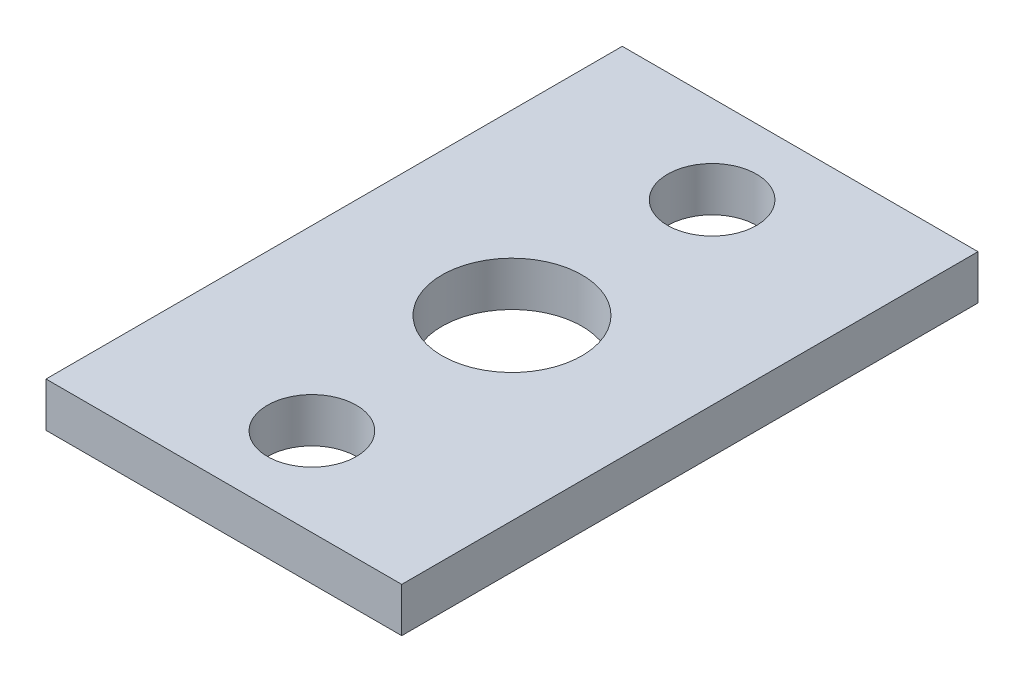
ISO-10303-21;
HEADER;
FILE_DESCRIPTION(('STEP AP214'),'2;1');
FILE_NAME('part.step','',(''),(''),'','','');
FILE_SCHEMA(('AUTOMOTIVE_DESIGN { 1 0 10303 214 1 1 1 1 }'));
ENDSEC;
DATA;
#1=APPLICATION_CONTEXT('core data for automotive mechanical design processes');
#2=APPLICATION_PROTOCOL_DEFINITION('international standard','automotive_design',2000,#1);
#3=PRODUCT_CONTEXT('',#1,'mechanical');
#4=PRODUCT('Part','Part','',(#3));
#5=PRODUCT_RELATED_PRODUCT_CATEGORY('part','',(#4));
#6=PRODUCT_DEFINITION_FORMATION('','',#4);
#7=PRODUCT_DEFINITION_CONTEXT('part definition',#1,'design');
#8=PRODUCT_DEFINITION('design','',#6,#7);
#9=PRODUCT_DEFINITION_SHAPE('','',#8);
#10=(LENGTH_UNIT() NAMED_UNIT(*) SI_UNIT(.MILLI.,.METRE.));
#11=(NAMED_UNIT(*) PLANE_ANGLE_UNIT() SI_UNIT($,.RADIAN.));
#12=(NAMED_UNIT(*) SI_UNIT($,.STERADIAN.) SOLID_ANGLE_UNIT());
#13=UNCERTAINTY_MEASURE_WITH_UNIT(LENGTH_MEASURE(1.E-05),#10,'distance_accuracy_value','');
#14=(GEOMETRIC_REPRESENTATION_CONTEXT(3) GLOBAL_UNCERTAINTY_ASSIGNED_CONTEXT((#13)) GLOBAL_UNIT_ASSIGNED_CONTEXT((#10,
#11,#12)) REPRESENTATION_CONTEXT('',''));
#15=CARTESIAN_POINT('',(0.,0.,0.));
#16=DIRECTION('',(0.,0.,1.));
#17=DIRECTION('',(1.,0.,0.));
#18=AXIS2_PLACEMENT_3D('',#15,#16,#17);
#19=CARTESIAN_POINT('',(-6.35,1.5875,10.287));
#20=DIRECTION('',(0.,1.,0.));
#21=DIRECTION('',(0.,0.,1.));
#22=AXIS2_PLACEMENT_3D('',#19,#20,#21);
#23=PLANE('',#22);
#24=CARTESIAN_POINT('',(0.,1.5875,7.14375));
#25=DIRECTION('',(0.,1.,0.));
#26=DIRECTION('',(0.,0.,-1.));
#27=AXIS2_PLACEMENT_3D('',#24,#25,#26);
#28=CIRCLE('',#27,1.5875);
#29=CARTESIAN_POINT('',(0.,1.5875,5.55625));
#30=VERTEX_POINT('',#29);
#31=EDGE_CURVE('E116',#30,#30,#28,.T.);
#32=ORIENTED_EDGE('',*,*,#31,.F.);
#33=EDGE_LOOP('',(#32));
#34=FACE_BOUND('',#33,.T.);
#35=DIRECTION('',(0.,0.,1.));
#36=VECTOR('',#35,1.);
#37=CARTESIAN_POINT('',(-6.35,1.5875,-10.287));
#38=LINE('',#37,#36);
#39=CARTESIAN_POINT('',(-6.35,1.5875,-10.287));
#40=VERTEX_POINT('',#39);
#41=CARTESIAN_POINT('',(-6.35,1.5875,10.287));
#42=VERTEX_POINT('',#41);
#43=EDGE_CURVE('E86',#40,#42,#38,.T.);
#44=ORIENTED_EDGE('',*,*,#43,.T.);
#45=DIRECTION('',(1.,0.,0.));
#46=VECTOR('',#45,1.);
#47=CARTESIAN_POINT('',(-6.35,1.5875,10.287));
#48=LINE('',#47,#46);
#49=CARTESIAN_POINT('',(6.35,1.5875,10.287));
#50=VERTEX_POINT('',#49);
#51=EDGE_CURVE('E81',#42,#50,#48,.T.);
#52=ORIENTED_EDGE('',*,*,#51,.T.);
#53=DIRECTION('',(0.,0.,-1.));
#54=VECTOR('',#53,1.);
#55=CARTESIAN_POINT('',(6.35,1.5875,-10.287));
#56=LINE('',#55,#54);
#57=CARTESIAN_POINT('',(6.35,1.5875,-10.287));
#58=VERTEX_POINT('',#57);
#59=EDGE_CURVE('E84',#50,#58,#56,.T.);
#60=ORIENTED_EDGE('',*,*,#59,.T.);
#61=DIRECTION('',(-1.,0.,0.));
#62=VECTOR('',#61,1.);
#63=CARTESIAN_POINT('',(-6.35,1.5875,-10.287));
#64=LINE('',#63,#62);
#65=EDGE_CURVE('E51',#58,#40,#64,.T.);
#66=ORIENTED_EDGE('',*,*,#65,.T.);
#67=EDGE_LOOP('',(#44,#52,#60,#66));
#68=FACE_BOUND('',#67,.T.);
#69=CARTESIAN_POINT('',(0.,1.5875,-7.14375));
#70=DIRECTION('',(0.,1.,0.));
#71=DIRECTION('',(0.,0.,1.));
#72=AXIS2_PLACEMENT_3D('',#69,#70,#71);
#73=CIRCLE('',#72,1.5875);
#74=CARTESIAN_POINT('',(0.,1.5875,-5.55625));
#75=VERTEX_POINT('',#74);
#76=EDGE_CURVE('E101',#75,#75,#73,.T.);
#77=ORIENTED_EDGE('',*,*,#76,.F.);
#78=EDGE_LOOP('',(#77));
#79=FACE_BOUND('',#78,.T.);
#80=CARTESIAN_POINT('',(0.,1.5875,0.));
#81=DIRECTION('',(0.,1.,0.));
#82=DIRECTION('',(0.,0.,1.));
#83=AXIS2_PLACEMENT_3D('',#80,#81,#82);
#84=CIRCLE('',#83,2.5);
#85=CARTESIAN_POINT('',(0.,1.5875,2.5));
#86=VERTEX_POINT('',#85);
#87=EDGE_CURVE('E122',#86,#86,#84,.T.);
#88=ORIENTED_EDGE('',*,*,#87,.F.);
#89=EDGE_LOOP('',(#88));
#90=FACE_BOUND('',#89,.T.);
#91=ADVANCED_FACE('F34',(#34,#68,#79,#90),#23,.T.);
#92=CARTESIAN_POINT('',(-6.35,0.,10.287));
#93=DIRECTION('',(0.,1.,0.));
#94=DIRECTION('',(0.,0.,1.));
#95=AXIS2_PLACEMENT_3D('',#92,#93,#94);
#96=PLANE('',#95);
#97=CARTESIAN_POINT('',(0.,0.,7.14375));
#98=DIRECTION('',(0.,1.,0.));
#99=DIRECTION('',(0.,0.,-1.));
#100=AXIS2_PLACEMENT_3D('',#97,#98,#99);
#101=CIRCLE('',#100,1.5875);
#102=CARTESIAN_POINT('',(0.,0.,5.55625));
#103=VERTEX_POINT('',#102);
#104=EDGE_CURVE('E119',#103,#103,#101,.T.);
#105=ORIENTED_EDGE('',*,*,#104,.T.);
#106=EDGE_LOOP('',(#105));
#107=FACE_BOUND('',#106,.T.);
#108=DIRECTION('',(0.,0.,1.));
#109=VECTOR('',#108,1.);
#110=CARTESIAN_POINT('',(-6.35,0.,-10.287));
#111=LINE('',#110,#109);
#112=CARTESIAN_POINT('',(-6.35,0.,-10.287));
#113=VERTEX_POINT('',#112);
#114=CARTESIAN_POINT('',(-6.35,0.,10.287));
#115=VERTEX_POINT('',#114);
#116=EDGE_CURVE('E98',#113,#115,#111,.T.);
#117=ORIENTED_EDGE('',*,*,#116,.F.);
#118=DIRECTION('',(-1.,0.,0.));
#119=VECTOR('',#118,1.);
#120=CARTESIAN_POINT('',(-6.35,0.,-10.287));
#121=LINE('',#120,#119);
#122=CARTESIAN_POINT('',(6.35,0.,-10.287));
#123=VERTEX_POINT('',#122);
#124=EDGE_CURVE('E74',#123,#113,#121,.T.);
#125=ORIENTED_EDGE('',*,*,#124,.F.);
#126=DIRECTION('',(0.,0.,-1.));
#127=VECTOR('',#126,1.);
#128=CARTESIAN_POINT('',(6.35,0.,-10.287));
#129=LINE('',#128,#127);
#130=CARTESIAN_POINT('',(6.35,0.,10.287));
#131=VERTEX_POINT('',#130);
#132=EDGE_CURVE('E68',#131,#123,#129,.T.);
#133=ORIENTED_EDGE('',*,*,#132,.F.);
#134=DIRECTION('',(1.,0.,0.));
#135=VECTOR('',#134,1.);
#136=CARTESIAN_POINT('',(-6.35,0.,10.287));
#137=LINE('',#136,#135);
#138=EDGE_CURVE('E90',#115,#131,#137,.T.);
#139=ORIENTED_EDGE('',*,*,#138,.F.);
#140=EDGE_LOOP('',(#117,#125,#133,#139));
#141=FACE_BOUND('',#140,.T.);
#142=CARTESIAN_POINT('',(0.,0.,-7.14375));
#143=DIRECTION('',(0.,1.,0.));
#144=DIRECTION('',(0.,0.,1.));
#145=AXIS2_PLACEMENT_3D('',#142,#143,#144);
#146=CIRCLE('',#145,1.5875);
#147=CARTESIAN_POINT('',(0.,0.,-5.55625));
#148=VERTEX_POINT('',#147);
#149=EDGE_CURVE('E113',#148,#148,#146,.T.);
#150=ORIENTED_EDGE('',*,*,#149,.T.);
#151=EDGE_LOOP('',(#150));
#152=FACE_BOUND('',#151,.T.);
#153=CARTESIAN_POINT('',(0.,0.,0.));
#154=DIRECTION('',(0.,1.,0.));
#155=DIRECTION('',(0.,0.,1.));
#156=AXIS2_PLACEMENT_3D('',#153,#154,#155);
#157=CIRCLE('',#156,2.5);
#158=CARTESIAN_POINT('',(0.,0.,2.5));
#159=VERTEX_POINT('',#158);
#160=EDGE_CURVE('E125',#159,#159,#157,.T.);
#161=ORIENTED_EDGE('',*,*,#160,.T.);
#162=EDGE_LOOP('',(#161));
#163=FACE_BOUND('',#162,.T.);
#164=ADVANCED_FACE('F109',(#107,#141,#152,#163),#96,.F.);
#165=CARTESIAN_POINT('',(-6.35,1.5875,-10.287));
#166=DIRECTION('',(1.,0.,0.));
#167=DIRECTION('',(0.,0.,-1.));
#168=AXIS2_PLACEMENT_3D('',#165,#166,#167);
#169=PLANE('',#168);
#170=ORIENTED_EDGE('',*,*,#116,.T.);
#171=DIRECTION('',(0.,-1.,0.));
#172=VECTOR('',#171,1.);
#173=CARTESIAN_POINT('',(-6.35,1.5875,10.287));
#174=LINE('',#173,#172);
#175=EDGE_CURVE('E11',#42,#115,#174,.T.);
#176=ORIENTED_EDGE('',*,*,#175,.F.);
#177=ORIENTED_EDGE('',*,*,#43,.F.);
#178=DIRECTION('',(0.,-1.,0.));
#179=VECTOR('',#178,1.);
#180=CARTESIAN_POINT('',(-6.35,1.5875,-10.287));
#181=LINE('',#180,#179);
#182=EDGE_CURVE('E94',#40,#113,#181,.T.);
#183=ORIENTED_EDGE('',*,*,#182,.T.);
#184=EDGE_LOOP('',(#170,#176,#177,#183));
#185=FACE_BOUND('',#184,.T.);
#186=ADVANCED_FACE('F36',(#185),#169,.F.);
#187=CARTESIAN_POINT('',(-6.35,1.5875,10.287));
#188=DIRECTION('',(0.,0.,-1.));
#189=DIRECTION('',(-1.,0.,0.));
#190=AXIS2_PLACEMENT_3D('',#187,#188,#189);
#191=PLANE('',#190);
#192=ORIENTED_EDGE('',*,*,#138,.T.);
#193=DIRECTION('',(0.,-1.,0.));
#194=VECTOR('',#193,1.);
#195=CARTESIAN_POINT('',(6.35,1.5875,10.287));
#196=LINE('',#195,#194);
#197=EDGE_CURVE('E43',#50,#131,#196,.T.);
#198=ORIENTED_EDGE('',*,*,#197,.F.);
#199=ORIENTED_EDGE('',*,*,#51,.F.);
#200=ORIENTED_EDGE('',*,*,#175,.T.);
#201=EDGE_LOOP('',(#192,#198,#199,#200));
#202=FACE_BOUND('',#201,.T.);
#203=ADVANCED_FACE('F89',(#202),#191,.F.);
#204=CARTESIAN_POINT('',(6.35,1.5875,-10.287));
#205=DIRECTION('',(-1.,0.,0.));
#206=DIRECTION('',(0.,0.,1.));
#207=AXIS2_PLACEMENT_3D('',#204,#205,#206);
#208=PLANE('',#207);
#209=ORIENTED_EDGE('',*,*,#132,.T.);
#210=DIRECTION('',(0.,-1.,0.));
#211=VECTOR('',#210,1.);
#212=CARTESIAN_POINT('',(6.35,1.5875,-10.287));
#213=LINE('',#212,#211);
#214=EDGE_CURVE('E91',#58,#123,#213,.T.);
#215=ORIENTED_EDGE('',*,*,#214,.F.);
#216=ORIENTED_EDGE('',*,*,#59,.F.);
#217=ORIENTED_EDGE('',*,*,#197,.T.);
#218=EDGE_LOOP('',(#209,#215,#216,#217));
#219=FACE_BOUND('',#218,.T.);
#220=ADVANCED_FACE('F92',(#219),#208,.F.);
#221=CARTESIAN_POINT('',(-6.35,1.5875,-10.287));
#222=DIRECTION('',(0.,0.,1.));
#223=DIRECTION('',(1.,0.,0.));
#224=AXIS2_PLACEMENT_3D('',#221,#222,#223);
#225=PLANE('',#224);
#226=ORIENTED_EDGE('',*,*,#124,.T.);
#227=ORIENTED_EDGE('',*,*,#182,.F.);
#228=ORIENTED_EDGE('',*,*,#65,.F.);
#229=ORIENTED_EDGE('',*,*,#214,.T.);
#230=EDGE_LOOP('',(#226,#227,#228,#229));
#231=FACE_BOUND('',#230,.T.);
#232=ADVANCED_FACE('F106',(#231),#225,.F.);
#233=CARTESIAN_POINT('',(0.,1.5875,-7.14375));
#234=DIRECTION('',(0.,-1.,0.));
#235=DIRECTION('',(0.,0.,-1.));
#236=AXIS2_PLACEMENT_3D('',#233,#234,#235);
#237=CYLINDRICAL_SURFACE('',#236,1.5875);
#238=ORIENTED_EDGE('',*,*,#76,.T.);
#239=EDGE_LOOP('',(#238));
#240=FACE_BOUND('',#239,.T.);
#241=ORIENTED_EDGE('',*,*,#149,.F.);
#242=EDGE_LOOP('',(#241));
#243=FACE_BOUND('',#242,.T.);
#244=ADVANCED_FACE('F144',(#240,#243),#237,.F.);
#245=CARTESIAN_POINT('',(0.,1.5875,7.14375));
#246=DIRECTION('',(0.,-1.,0.));
#247=DIRECTION('',(0.,0.,-1.));
#248=AXIS2_PLACEMENT_3D('',#245,#246,#247);
#249=CYLINDRICAL_SURFACE('',#248,1.5875);
#250=ORIENTED_EDGE('',*,*,#31,.T.);
#251=EDGE_LOOP('',(#250));
#252=FACE_BOUND('',#251,.T.);
#253=ORIENTED_EDGE('',*,*,#104,.F.);
#254=EDGE_LOOP('',(#253));
#255=FACE_BOUND('',#254,.T.);
#256=ADVANCED_FACE('F172',(#252,#255),#249,.F.);
#257=CARTESIAN_POINT('',(0.,1.5875,0.));
#258=DIRECTION('',(0.,-1.,0.));
#259=DIRECTION('',(0.,0.,-1.));
#260=AXIS2_PLACEMENT_3D('',#257,#258,#259);
#261=CYLINDRICAL_SURFACE('',#260,2.5);
#262=ORIENTED_EDGE('',*,*,#87,.T.);
#263=EDGE_LOOP('',(#262));
#264=FACE_BOUND('',#263,.T.);
#265=ORIENTED_EDGE('',*,*,#160,.F.);
#266=EDGE_LOOP('',(#265));
#267=FACE_BOUND('',#266,.T.);
#268=ADVANCED_FACE('F131',(#264,#267),#261,.F.);
#269=CLOSED_SHELL('',(#91,#164,#186,#203,#220,#232,#244,#256,#268));
#270=MANIFOLD_SOLID_BREP('B2',#269);
#271=ADVANCED_BREP_SHAPE_REPRESENTATION('',(#18,#270),#14);
#272=SHAPE_DEFINITION_REPRESENTATION(#9,#271);
ENDSEC;
END-ISO-10303-21;
